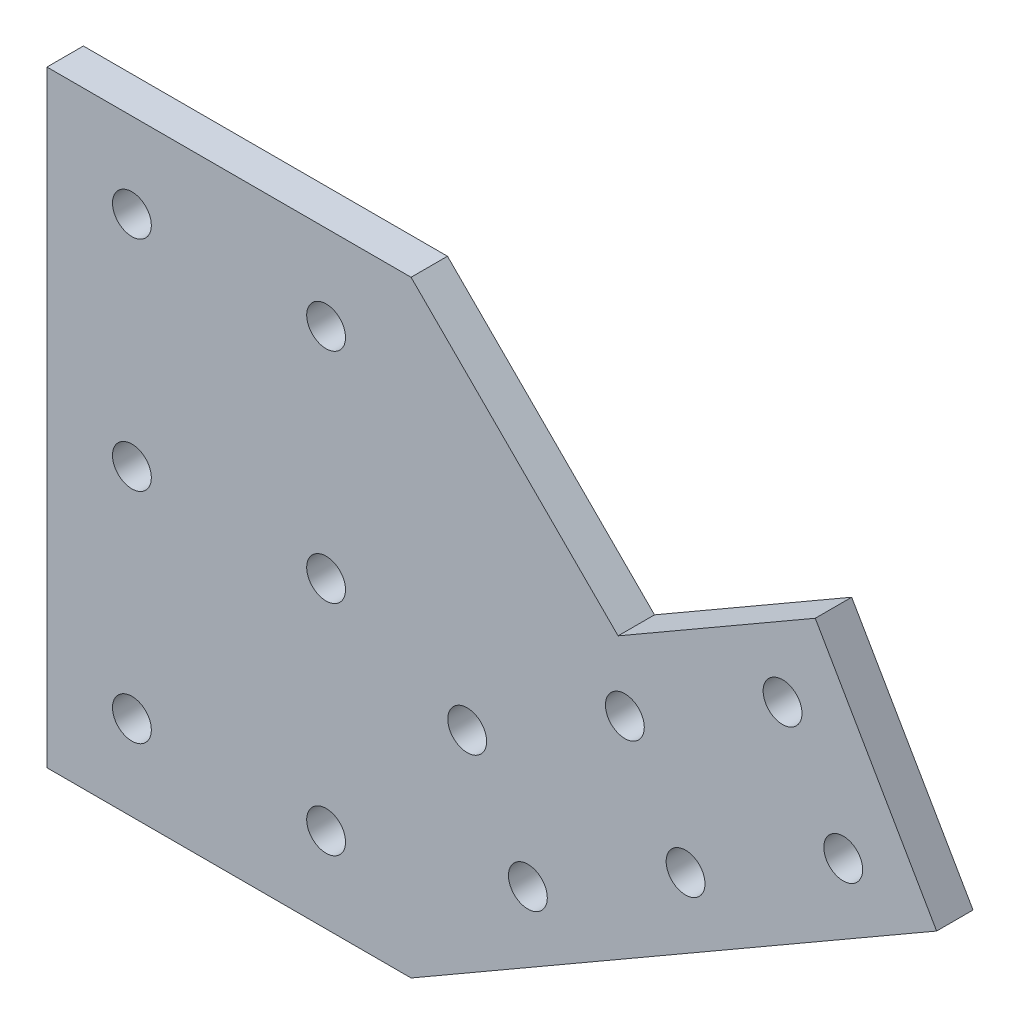
ISO-10303-21;
HEADER;
FILE_DESCRIPTION(('STEP AP214'),'2;1');
FILE_NAME('part.step','',(''),(''),'','','');
FILE_SCHEMA(('AUTOMOTIVE_DESIGN { 1 0 10303 214 1 1 1 1 }'));
ENDSEC;
DATA;
#1=APPLICATION_CONTEXT('core data for automotive mechanical design processes');
#2=APPLICATION_PROTOCOL_DEFINITION('international standard','automotive_design',2000,#1);
#3=PRODUCT_CONTEXT('',#1,'mechanical');
#4=PRODUCT('Part','Part','',(#3));
#5=PRODUCT_RELATED_PRODUCT_CATEGORY('part','',(#4));
#6=PRODUCT_DEFINITION_FORMATION('','',#4);
#7=PRODUCT_DEFINITION_CONTEXT('part definition',#1,'design');
#8=PRODUCT_DEFINITION('design','',#6,#7);
#9=PRODUCT_DEFINITION_SHAPE('','',#8);
#10=(LENGTH_UNIT() NAMED_UNIT(*) SI_UNIT(.MILLI.,.METRE.));
#11=(NAMED_UNIT(*) PLANE_ANGLE_UNIT() SI_UNIT($,.RADIAN.));
#12=(NAMED_UNIT(*) SI_UNIT($,.STERADIAN.) SOLID_ANGLE_UNIT());
#13=UNCERTAINTY_MEASURE_WITH_UNIT(LENGTH_MEASURE(1.E-05),#10,'distance_accuracy_value','');
#14=(GEOMETRIC_REPRESENTATION_CONTEXT(3) GLOBAL_UNCERTAINTY_ASSIGNED_CONTEXT((#13)) GLOBAL_UNIT_ASSIGNED_CONTEXT((#10,
#11,#12)) REPRESENTATION_CONTEXT('',''));
#15=CARTESIAN_POINT('',(0.,0.,0.));
#16=DIRECTION('',(0.,0.,1.));
#17=DIRECTION('',(1.,0.,0.));
#18=AXIS2_PLACEMENT_3D('',#15,#16,#17);
#19=CARTESIAN_POINT('',(43.301270189222,24.9999999999999,3.));
#20=DIRECTION('',(-0.499999999999998,0.86602540378444,0.));
#21=DIRECTION('',(-0.86602540378444,-0.499999999999998,0.));
#22=AXIS2_PLACEMENT_3D('',#19,#20,#21);
#23=PLANE('',#22);
#24=DIRECTION('',(0.86602540378444,0.499999999999998,0.));
#25=VECTOR('',#24,1.);
#26=CARTESIAN_POINT('',(43.301270189222,24.9999999999999,0.));
#27=LINE('',#26,#25);
#28=CARTESIAN_POINT('',(0.,0.,0.));
#29=VERTEX_POINT('',#28);
#30=CARTESIAN_POINT('',(43.301270189222,24.9999999999999,0.));
#31=VERTEX_POINT('',#30);
#32=EDGE_CURVE('E129',#29,#31,#27,.T.);
#33=ORIENTED_EDGE('',*,*,#32,.T.);
#34=DIRECTION('',(0.,0.,-1.));
#35=VECTOR('',#34,1.);
#36=CARTESIAN_POINT('',(43.301270189222,24.9999999999999,3.));
#37=LINE('',#36,#35);
#38=CARTESIAN_POINT('',(43.301270189222,24.9999999999999,3.));
#39=VERTEX_POINT('',#38);
#40=EDGE_CURVE('E11',#39,#31,#37,.T.);
#41=ORIENTED_EDGE('',*,*,#40,.F.);
#42=DIRECTION('',(0.86602540378444,0.499999999999998,0.));
#43=VECTOR('',#42,1.);
#44=CARTESIAN_POINT('',(43.301270189222,24.9999999999999,3.));
#45=LINE('',#44,#43);
#46=CARTESIAN_POINT('',(0.,0.,3.));
#47=VERTEX_POINT('',#46);
#48=EDGE_CURVE('E142',#47,#39,#45,.T.);
#49=ORIENTED_EDGE('',*,*,#48,.F.);
#50=DIRECTION('',(0.,0.,-1.));
#51=VECTOR('',#50,1.);
#52=CARTESIAN_POINT('',(0.,0.,3.));
#53=LINE('',#52,#51);
#54=EDGE_CURVE('E125',#47,#29,#53,.T.);
#55=ORIENTED_EDGE('',*,*,#54,.T.);
#56=EDGE_LOOP('',(#33,#41,#49,#55));
#57=FACE_BOUND('',#56,.T.);
#58=ADVANCED_FACE('F39',(#57),#23,.F.);
#59=CARTESIAN_POINT('',(33.301270189222,42.3205080756887,3.));
#60=DIRECTION('',(-0.86602540378444,-0.499999999999998,0.));
#61=DIRECTION('',(0.499999999999998,-0.86602540378444,0.));
#62=AXIS2_PLACEMENT_3D('',#59,#60,#61);
#63=PLANE('',#62);
#64=DIRECTION('',(-0.499999999999998,0.86602540378444,0.));
#65=VECTOR('',#64,1.);
#66=CARTESIAN_POINT('',(33.301270189222,42.3205080756887,0.));
#67=LINE('',#66,#65);
#68=CARTESIAN_POINT('',(33.301270189222,42.3205080756887,0.));
#69=VERTEX_POINT('',#68);
#70=EDGE_CURVE('E132',#31,#69,#67,.T.);
#71=ORIENTED_EDGE('',*,*,#70,.T.);
#72=DIRECTION('',(0.,0.,-1.));
#73=VECTOR('',#72,1.);
#74=CARTESIAN_POINT('',(33.301270189222,42.3205080756887,3.));
#75=LINE('',#74,#73);
#76=CARTESIAN_POINT('',(33.301270189222,42.3205080756887,3.));
#77=VERTEX_POINT('',#76);
#78=EDGE_CURVE('E47',#77,#69,#75,.T.);
#79=ORIENTED_EDGE('',*,*,#78,.F.);
#80=DIRECTION('',(-0.499999999999998,0.86602540378444,0.));
#81=VECTOR('',#80,1.);
#82=CARTESIAN_POINT('',(33.301270189222,42.3205080756887,3.));
#83=LINE('',#82,#81);
#84=EDGE_CURVE('E95',#39,#77,#83,.T.);
#85=ORIENTED_EDGE('',*,*,#84,.F.);
#86=ORIENTED_EDGE('',*,*,#40,.T.);
#87=EDGE_LOOP('',(#71,#79,#85,#86));
#88=FACE_BOUND('',#87,.T.);
#89=ADVANCED_FACE('F274',(#88),#63,.F.);
#90=CARTESIAN_POINT('',(17.0577136594005,32.9422863405994,3.));
#91=DIRECTION('',(0.499999999999998,-0.86602540378444,0.));
#92=DIRECTION('',(0.86602540378444,0.499999999999998,0.));
#93=AXIS2_PLACEMENT_3D('',#90,#91,#92);
#94=PLANE('',#93);
#95=DIRECTION('',(-0.86602540378444,-0.499999999999998,0.));
#96=VECTOR('',#95,1.);
#97=CARTESIAN_POINT('',(17.0577136594005,32.9422863405994,0.));
#98=LINE('',#97,#96);
#99=CARTESIAN_POINT('',(17.0577136594005,32.9422863405994,0.));
#100=VERTEX_POINT('',#99);
#101=EDGE_CURVE('E135',#69,#100,#98,.T.);
#102=ORIENTED_EDGE('',*,*,#101,.T.);
#103=DIRECTION('',(0.,0.,-1.));
#104=VECTOR('',#103,1.);
#105=CARTESIAN_POINT('',(17.0577136594005,32.9422863405994,3.));
#106=LINE('',#105,#104);
#107=CARTESIAN_POINT('',(17.0577136594005,32.9422863405994,3.));
#108=VERTEX_POINT('',#107);
#109=EDGE_CURVE('E146',#108,#100,#106,.T.);
#110=ORIENTED_EDGE('',*,*,#109,.F.);
#111=DIRECTION('',(-0.86602540378444,-0.499999999999998,0.));
#112=VECTOR('',#111,1.);
#113=CARTESIAN_POINT('',(17.0577136594005,32.9422863405994,3.));
#114=LINE('',#113,#112);
#115=EDGE_CURVE('E154',#77,#108,#114,.T.);
#116=ORIENTED_EDGE('',*,*,#115,.F.);
#117=ORIENTED_EDGE('',*,*,#78,.T.);
#118=EDGE_LOOP('',(#102,#110,#116,#117));
#119=FACE_BOUND('',#118,.T.);
#120=ADVANCED_FACE('F152',(#119),#94,.F.);
#121=CARTESIAN_POINT('',(0.,50.,3.));
#122=DIRECTION('',(-0.707106781186551,-0.707106781186544,0.));
#123=DIRECTION('',(0.707106781186544,-0.707106781186551,0.));
#124=AXIS2_PLACEMENT_3D('',#121,#122,#123);
#125=PLANE('',#124);
#126=DIRECTION('',(-0.707106781186544,0.707106781186551,0.));
#127=VECTOR('',#126,1.);
#128=CARTESIAN_POINT('',(0.,50.,0.));
#129=LINE('',#128,#127);
#130=CARTESIAN_POINT('',(0.,50.,0.));
#131=VERTEX_POINT('',#130);
#132=EDGE_CURVE('E137',#100,#131,#129,.T.);
#133=ORIENTED_EDGE('',*,*,#132,.T.);
#134=DIRECTION('',(0.,0.,-1.));
#135=VECTOR('',#134,1.);
#136=CARTESIAN_POINT('',(0.,50.,3.));
#137=LINE('',#136,#135);
#138=CARTESIAN_POINT('',(0.,50.,3.));
#139=VERTEX_POINT('',#138);
#140=EDGE_CURVE('E120',#139,#131,#137,.T.);
#141=ORIENTED_EDGE('',*,*,#140,.F.);
#142=DIRECTION('',(-0.707106781186544,0.707106781186551,0.));
#143=VECTOR('',#142,1.);
#144=CARTESIAN_POINT('',(0.,50.,3.));
#145=LINE('',#144,#143);
#146=EDGE_CURVE('E111',#108,#139,#145,.T.);
#147=ORIENTED_EDGE('',*,*,#146,.F.);
#148=ORIENTED_EDGE('',*,*,#109,.T.);
#149=EDGE_LOOP('',(#133,#141,#147,#148));
#150=FACE_BOUND('',#149,.T.);
#151=ADVANCED_FACE('F160',(#150),#125,.F.);
#152=CARTESIAN_POINT('',(-30.,50.,3.));
#153=DIRECTION('',(0.,-1.,0.));
#154=DIRECTION('',(0.,0.,-1.));
#155=AXIS2_PLACEMENT_3D('',#152,#153,#154);
#156=PLANE('',#155);
#157=DIRECTION('',(-1.,0.,0.));
#158=VECTOR('',#157,1.);
#159=CARTESIAN_POINT('',(-30.,50.,0.));
#160=LINE('',#159,#158);
#161=CARTESIAN_POINT('',(-30.,50.,0.));
#162=VERTEX_POINT('',#161);
#163=EDGE_CURVE('E119',#131,#162,#160,.T.);
#164=ORIENTED_EDGE('',*,*,#163,.T.);
#165=DIRECTION('',(0.,0.,-1.));
#166=VECTOR('',#165,1.);
#167=CARTESIAN_POINT('',(-30.,50.,3.));
#168=LINE('',#167,#166);
#169=CARTESIAN_POINT('',(-30.,50.,3.));
#170=VERTEX_POINT('',#169);
#171=EDGE_CURVE('E116',#170,#162,#168,.T.);
#172=ORIENTED_EDGE('',*,*,#171,.F.);
#173=DIRECTION('',(-1.,0.,0.));
#174=VECTOR('',#173,1.);
#175=CARTESIAN_POINT('',(-30.,50.,3.));
#176=LINE('',#175,#174);
#177=EDGE_CURVE('E105',#139,#170,#176,.T.);
#178=ORIENTED_EDGE('',*,*,#177,.F.);
#179=ORIENTED_EDGE('',*,*,#140,.T.);
#180=EDGE_LOOP('',(#164,#172,#178,#179));
#181=FACE_BOUND('',#180,.T.);
#182=ADVANCED_FACE('F117',(#181),#156,.F.);
#183=CARTESIAN_POINT('',(-30.,0.,3.));
#184=DIRECTION('',(1.,0.,0.));
#185=DIRECTION('',(0.,0.,-1.));
#186=AXIS2_PLACEMENT_3D('',#183,#184,#185);
#187=PLANE('',#186);
#188=DIRECTION('',(0.,-1.,0.));
#189=VECTOR('',#188,1.);
#190=CARTESIAN_POINT('',(-30.,0.,0.));
#191=LINE('',#190,#189);
#192=CARTESIAN_POINT('',(-30.,0.,0.));
#193=VERTEX_POINT('',#192);
#194=EDGE_CURVE('E81',#162,#193,#191,.T.);
#195=ORIENTED_EDGE('',*,*,#194,.T.);
#196=DIRECTION('',(0.,0.,-1.));
#197=VECTOR('',#196,1.);
#198=CARTESIAN_POINT('',(-30.,0.,3.));
#199=LINE('',#198,#197);
#200=CARTESIAN_POINT('',(-30.,0.,3.));
#201=VERTEX_POINT('',#200);
#202=EDGE_CURVE('E121',#201,#193,#199,.T.);
#203=ORIENTED_EDGE('',*,*,#202,.F.);
#204=DIRECTION('',(0.,-1.,0.));
#205=VECTOR('',#204,1.);
#206=CARTESIAN_POINT('',(-30.,0.,3.));
#207=LINE('',#206,#205);
#208=EDGE_CURVE('E109',#170,#201,#207,.T.);
#209=ORIENTED_EDGE('',*,*,#208,.F.);
#210=ORIENTED_EDGE('',*,*,#171,.T.);
#211=EDGE_LOOP('',(#195,#203,#209,#210));
#212=FACE_BOUND('',#211,.T.);
#213=ADVANCED_FACE('F123',(#212),#187,.F.);
#214=CARTESIAN_POINT('',(0.,0.,3.));
#215=DIRECTION('',(0.,1.,0.));
#216=DIRECTION('',(-1.,0.,0.));
#217=AXIS2_PLACEMENT_3D('',#214,#215,#216);
#218=PLANE('',#217);
#219=DIRECTION('',(1.,0.,0.));
#220=VECTOR('',#219,1.);
#221=CARTESIAN_POINT('',(0.,0.,0.));
#222=LINE('',#221,#220);
#223=EDGE_CURVE('E87',#193,#29,#222,.T.);
#224=ORIENTED_EDGE('',*,*,#223,.T.);
#225=ORIENTED_EDGE('',*,*,#54,.F.);
#226=DIRECTION('',(1.,0.,0.));
#227=VECTOR('',#226,1.);
#228=CARTESIAN_POINT('',(0.,0.,3.));
#229=LINE('',#228,#227);
#230=EDGE_CURVE('E55',#201,#47,#229,.T.);
#231=ORIENTED_EDGE('',*,*,#230,.F.);
#232=ORIENTED_EDGE('',*,*,#202,.T.);
#233=EDGE_LOOP('',(#224,#225,#231,#232));
#234=FACE_BOUND('',#233,.T.);
#235=ADVANCED_FACE('F249',(#234),#218,.F.);
#236=CARTESIAN_POINT('',(0.,0.,3.));
#237=DIRECTION('',(0.,0.,1.));
#238=DIRECTION('',(1.,0.,0.));
#239=AXIS2_PLACEMENT_3D('',#236,#237,#238);
#240=PLANE('',#239);
#241=CARTESIAN_POINT('',(-7.,25.,3.));
#242=DIRECTION('',(0.,0.,1.));
#243=DIRECTION('',(1.,0.,0.));
#244=AXIS2_PLACEMENT_3D('',#241,#242,#243);
#245=CIRCLE('',#244,1.6);
#246=CARTESIAN_POINT('',(-5.4,25.,3.));
#247=VERTEX_POINT('',#246);
#248=EDGE_CURVE('E202',#247,#247,#245,.T.);
#249=ORIENTED_EDGE('',*,*,#248,.F.);
#250=EDGE_LOOP('',(#249));
#251=FACE_BOUND('',#250,.T.);
#252=CARTESIAN_POINT('',(30.6051177665153,34.9903810567666,3.));
#253=DIRECTION('',(0.,0.,1.));
#254=DIRECTION('',(1.,0.,0.));
#255=AXIS2_PLACEMENT_3D('',#252,#253,#254);
#256=CIRCLE('',#255,1.6);
#257=CARTESIAN_POINT('',(32.2051177665153,34.9903810567666,3.));
#258=VERTEX_POINT('',#257);
#259=EDGE_CURVE('E195',#258,#258,#256,.T.);
#260=ORIENTED_EDGE('',*,*,#259,.F.);
#261=EDGE_LOOP('',(#260));
#262=FACE_BOUND('',#261,.T.);
#263=CARTESIAN_POINT('',(35.6051177665153,26.3301270189222,3.));
#264=DIRECTION('',(0.,0.,1.));
#265=DIRECTION('',(1.,0.,0.));
#266=AXIS2_PLACEMENT_3D('',#263,#264,#265);
#267=CIRCLE('',#266,1.6);
#268=CARTESIAN_POINT('',(37.2051177665153,26.3301270189222,3.));
#269=VERTEX_POINT('',#268);
#270=EDGE_CURVE('E214',#269,#269,#267,.T.);
#271=ORIENTED_EDGE('',*,*,#270,.F.);
#272=EDGE_LOOP('',(#271));
#273=FACE_BOUND('',#272,.T.);
#274=CARTESIAN_POINT('',(22.6147367097487,18.8301270189222,3.));
#275=DIRECTION('',(0.,0.,1.));
#276=DIRECTION('',(1.,0.,0.));
#277=AXIS2_PLACEMENT_3D('',#274,#275,#276);
#278=CIRCLE('',#277,1.6);
#279=CARTESIAN_POINT('',(24.2147367097487,18.8301270189222,3.));
#280=VERTEX_POINT('',#279);
#281=EDGE_CURVE('E207',#280,#280,#278,.T.);
#282=ORIENTED_EDGE('',*,*,#281,.F.);
#283=EDGE_LOOP('',(#282));
#284=FACE_BOUND('',#283,.T.);
#285=CARTESIAN_POINT('',(-7.,43.,3.));
#286=DIRECTION('',(0.,0.,1.));
#287=DIRECTION('',(1.,0.,0.));
#288=AXIS2_PLACEMENT_3D('',#285,#286,#287);
#289=CIRCLE('',#288,1.6);
#290=CARTESIAN_POINT('',(-5.4,43.,3.));
#291=VERTEX_POINT('',#290);
#292=EDGE_CURVE('E178',#291,#291,#289,.T.);
#293=ORIENTED_EDGE('',*,*,#292,.F.);
#294=EDGE_LOOP('',(#293));
#295=FACE_BOUND('',#294,.T.);
#296=CARTESIAN_POINT('',(-23.,7.,3.));
#297=DIRECTION('',(0.,0.,1.));
#298=DIRECTION('',(1.,0.,0.));
#299=AXIS2_PLACEMENT_3D('',#296,#297,#298);
#300=CIRCLE('',#299,1.6);
#301=CARTESIAN_POINT('',(-21.4,7.,3.));
#302=VERTEX_POINT('',#301);
#303=EDGE_CURVE('E171',#302,#302,#300,.T.);
#304=ORIENTED_EDGE('',*,*,#303,.F.);
#305=EDGE_LOOP('',(#304));
#306=FACE_BOUND('',#305,.T.);
#307=CARTESIAN_POINT('',(-7.,7.,3.));
#308=DIRECTION('',(0.,0.,1.));
#309=DIRECTION('',(1.,0.,0.));
#310=AXIS2_PLACEMENT_3D('',#307,#308,#309);
#311=CIRCLE('',#310,1.6);
#312=CARTESIAN_POINT('',(-5.4,7.,3.));
#313=VERTEX_POINT('',#312);
#314=EDGE_CURVE('E190',#313,#313,#311,.T.);
#315=ORIENTED_EDGE('',*,*,#314,.F.);
#316=EDGE_LOOP('',(#315));
#317=FACE_BOUND('',#316,.T.);
#318=CARTESIAN_POINT('',(-23.,25.,3.));
#319=DIRECTION('',(0.,0.,1.));
#320=DIRECTION('',(1.,0.,0.));
#321=AXIS2_PLACEMENT_3D('',#318,#319,#320);
#322=CIRCLE('',#321,1.6);
#323=CARTESIAN_POINT('',(-21.4,25.,3.));
#324=VERTEX_POINT('',#323);
#325=EDGE_CURVE('E183',#324,#324,#322,.T.);
#326=ORIENTED_EDGE('',*,*,#325,.F.);
#327=EDGE_LOOP('',(#326));
#328=FACE_BOUND('',#327,.T.);
#329=CARTESIAN_POINT('',(17.6147367097487,27.4903810567666,3.));
#330=DIRECTION('',(0.,0.,1.));
#331=DIRECTION('',(1.,0.,0.));
#332=AXIS2_PLACEMENT_3D('',#329,#330,#331);
#333=CIRCLE('',#332,1.6);
#334=CARTESIAN_POINT('',(19.2147367097487,27.4903810567666,3.));
#335=VERTEX_POINT('',#334);
#336=EDGE_CURVE('E231',#335,#335,#333,.T.);
#337=ORIENTED_EDGE('',*,*,#336,.F.);
#338=EDGE_LOOP('',(#337));
#339=FACE_BOUND('',#338,.T.);
#340=CARTESIAN_POINT('',(4.62435565298215,19.9903810567666,3.));
#341=DIRECTION('',(0.,0.,1.));
#342=DIRECTION('',(1.,0.,0.));
#343=AXIS2_PLACEMENT_3D('',#340,#341,#342);
#344=CIRCLE('',#343,1.6);
#345=CARTESIAN_POINT('',(6.22435565298214,19.9903810567666,3.));
#346=VERTEX_POINT('',#345);
#347=EDGE_CURVE('E225',#346,#346,#344,.T.);
#348=ORIENTED_EDGE('',*,*,#347,.F.);
#349=EDGE_LOOP('',(#348));
#350=FACE_BOUND('',#349,.T.);
#351=CARTESIAN_POINT('',(9.62435565298215,11.3301270189222,3.));
#352=DIRECTION('',(0.,0.,1.));
#353=DIRECTION('',(1.,0.,0.));
#354=AXIS2_PLACEMENT_3D('',#351,#352,#353);
#355=CIRCLE('',#354,1.6);
#356=CARTESIAN_POINT('',(11.2243556529822,11.3301270189222,3.));
#357=VERTEX_POINT('',#356);
#358=EDGE_CURVE('E219',#357,#357,#355,.T.);
#359=ORIENTED_EDGE('',*,*,#358,.F.);
#360=EDGE_LOOP('',(#359));
#361=FACE_BOUND('',#360,.T.);
#362=CARTESIAN_POINT('',(-23.,43.,3.));
#363=DIRECTION('',(0.,0.,1.));
#364=DIRECTION('',(1.,0.,0.));
#365=AXIS2_PLACEMENT_3D('',#362,#363,#364);
#366=CIRCLE('',#365,1.6);
#367=CARTESIAN_POINT('',(-21.4,43.,3.));
#368=VERTEX_POINT('',#367);
#369=EDGE_CURVE('E165',#368,#368,#366,.T.);
#370=ORIENTED_EDGE('',*,*,#369,.F.);
#371=EDGE_LOOP('',(#370));
#372=FACE_BOUND('',#371,.T.);
#373=ORIENTED_EDGE('',*,*,#48,.T.);
#374=ORIENTED_EDGE('',*,*,#84,.T.);
#375=ORIENTED_EDGE('',*,*,#115,.T.);
#376=ORIENTED_EDGE('',*,*,#146,.T.);
#377=ORIENTED_EDGE('',*,*,#177,.T.);
#378=ORIENTED_EDGE('',*,*,#208,.T.);
#379=ORIENTED_EDGE('',*,*,#230,.T.);
#380=EDGE_LOOP('',(#373,#374,#375,#376,#377,#378,#379));
#381=FACE_BOUND('',#380,.T.);
#382=ADVANCED_FACE('F107',(#251,#262,#273,#284,#295,#306,#317,#328,#339,#350,#361,#372,#381),
#240,.T.);
#383=CARTESIAN_POINT('',(0.,0.,0.));
#384=DIRECTION('',(0.,0.,1.));
#385=DIRECTION('',(1.,0.,0.));
#386=AXIS2_PLACEMENT_3D('',#383,#384,#385);
#387=PLANE('',#386);
#388=CARTESIAN_POINT('',(-7.,25.,0.));
#389=DIRECTION('',(0.,0.,1.));
#390=DIRECTION('',(1.,0.,0.));
#391=AXIS2_PLACEMENT_3D('',#388,#389,#390);
#392=CIRCLE('',#391,1.6);
#393=CARTESIAN_POINT('',(-5.4,25.,0.));
#394=VERTEX_POINT('',#393);
#395=EDGE_CURVE('E187',#394,#394,#392,.T.);
#396=ORIENTED_EDGE('',*,*,#395,.T.);
#397=EDGE_LOOP('',(#396));
#398=FACE_BOUND('',#397,.T.);
#399=CARTESIAN_POINT('',(30.6051177665153,34.9903810567666,0.));
#400=DIRECTION('',(0.,0.,1.));
#401=DIRECTION('',(1.,0.,0.));
#402=AXIS2_PLACEMENT_3D('',#399,#400,#401);
#403=CIRCLE('',#402,1.6);
#404=CARTESIAN_POINT('',(32.2051177665153,34.9903810567666,0.));
#405=VERTEX_POINT('',#404);
#406=EDGE_CURVE('E198',#405,#405,#403,.T.);
#407=ORIENTED_EDGE('',*,*,#406,.T.);
#408=EDGE_LOOP('',(#407));
#409=FACE_BOUND('',#408,.T.);
#410=CARTESIAN_POINT('',(35.6051177665153,26.3301270189222,0.));
#411=DIRECTION('',(0.,0.,1.));
#412=DIRECTION('',(1.,0.,0.));
#413=AXIS2_PLACEMENT_3D('',#410,#411,#412);
#414=CIRCLE('',#413,1.6);
#415=CARTESIAN_POINT('',(37.2051177665153,26.3301270189222,0.));
#416=VERTEX_POINT('',#415);
#417=EDGE_CURVE('E199',#416,#416,#414,.T.);
#418=ORIENTED_EDGE('',*,*,#417,.T.);
#419=EDGE_LOOP('',(#418));
#420=FACE_BOUND('',#419,.T.);
#421=CARTESIAN_POINT('',(22.6147367097487,18.8301270189222,0.));
#422=DIRECTION('',(0.,0.,1.));
#423=DIRECTION('',(1.,0.,0.));
#424=AXIS2_PLACEMENT_3D('',#421,#422,#423);
#425=CIRCLE('',#424,1.6);
#426=CARTESIAN_POINT('',(24.2147367097487,18.8301270189222,0.));
#427=VERTEX_POINT('',#426);
#428=EDGE_CURVE('E210',#427,#427,#425,.T.);
#429=ORIENTED_EDGE('',*,*,#428,.T.);
#430=EDGE_LOOP('',(#429));
#431=FACE_BOUND('',#430,.T.);
#432=CARTESIAN_POINT('',(-7.,43.,0.));
#433=DIRECTION('',(0.,0.,1.));
#434=DIRECTION('',(1.,0.,0.));
#435=AXIS2_PLACEMENT_3D('',#432,#433,#434);
#436=CIRCLE('',#435,1.6);
#437=CARTESIAN_POINT('',(-5.4,43.,0.));
#438=VERTEX_POINT('',#437);
#439=EDGE_CURVE('E168',#438,#438,#436,.T.);
#440=ORIENTED_EDGE('',*,*,#439,.T.);
#441=EDGE_LOOP('',(#440));
#442=FACE_BOUND('',#441,.T.);
#443=CARTESIAN_POINT('',(-23.,7.,0.));
#444=DIRECTION('',(0.,0.,1.));
#445=DIRECTION('',(1.,0.,0.));
#446=AXIS2_PLACEMENT_3D('',#443,#444,#445);
#447=CIRCLE('',#446,1.6);
#448=CARTESIAN_POINT('',(-21.4,7.,0.));
#449=VERTEX_POINT('',#448);
#450=EDGE_CURVE('E174',#449,#449,#447,.T.);
#451=ORIENTED_EDGE('',*,*,#450,.T.);
#452=EDGE_LOOP('',(#451));
#453=FACE_BOUND('',#452,.T.);
#454=CARTESIAN_POINT('',(-7.,7.,0.));
#455=DIRECTION('',(0.,0.,1.));
#456=DIRECTION('',(1.,0.,0.));
#457=AXIS2_PLACEMENT_3D('',#454,#455,#456);
#458=CIRCLE('',#457,1.6);
#459=CARTESIAN_POINT('',(-5.4,7.,0.));
#460=VERTEX_POINT('',#459);
#461=EDGE_CURVE('E175',#460,#460,#458,.T.);
#462=ORIENTED_EDGE('',*,*,#461,.T.);
#463=EDGE_LOOP('',(#462));
#464=FACE_BOUND('',#463,.T.);
#465=CARTESIAN_POINT('',(-23.,25.,0.));
#466=DIRECTION('',(0.,0.,1.));
#467=DIRECTION('',(1.,0.,0.));
#468=AXIS2_PLACEMENT_3D('',#465,#466,#467);
#469=CIRCLE('',#468,1.6);
#470=CARTESIAN_POINT('',(-21.4,25.,0.));
#471=VERTEX_POINT('',#470);
#472=EDGE_CURVE('E186',#471,#471,#469,.T.);
#473=ORIENTED_EDGE('',*,*,#472,.T.);
#474=EDGE_LOOP('',(#473));
#475=FACE_BOUND('',#474,.T.);
#476=CARTESIAN_POINT('',(17.6147367097487,27.4903810567666,0.));
#477=DIRECTION('',(0.,0.,1.));
#478=DIRECTION('',(1.,0.,0.));
#479=AXIS2_PLACEMENT_3D('',#476,#477,#478);
#480=CIRCLE('',#479,1.6);
#481=CARTESIAN_POINT('',(19.2147367097487,27.4903810567666,0.));
#482=VERTEX_POINT('',#481);
#483=EDGE_CURVE('E211',#482,#482,#480,.T.);
#484=ORIENTED_EDGE('',*,*,#483,.T.);
#485=EDGE_LOOP('',(#484));
#486=FACE_BOUND('',#485,.T.);
#487=CARTESIAN_POINT('',(4.62435565298215,19.9903810567666,0.));
#488=DIRECTION('',(0.,0.,1.));
#489=DIRECTION('',(1.,0.,0.));
#490=AXIS2_PLACEMENT_3D('',#487,#488,#489);
#491=CIRCLE('',#490,1.6);
#492=CARTESIAN_POINT('',(6.22435565298214,19.9903810567666,0.));
#493=VERTEX_POINT('',#492);
#494=EDGE_CURVE('E228',#493,#493,#491,.T.);
#495=ORIENTED_EDGE('',*,*,#494,.T.);
#496=EDGE_LOOP('',(#495));
#497=FACE_BOUND('',#496,.T.);
#498=CARTESIAN_POINT('',(9.62435565298215,11.3301270189222,0.));
#499=DIRECTION('',(0.,0.,1.));
#500=DIRECTION('',(1.,0.,0.));
#501=AXIS2_PLACEMENT_3D('',#498,#499,#500);
#502=CIRCLE('',#501,1.6);
#503=CARTESIAN_POINT('',(11.2243556529822,11.3301270189222,0.));
#504=VERTEX_POINT('',#503);
#505=EDGE_CURVE('E222',#504,#504,#502,.T.);
#506=ORIENTED_EDGE('',*,*,#505,.T.);
#507=EDGE_LOOP('',(#506));
#508=FACE_BOUND('',#507,.T.);
#509=CARTESIAN_POINT('',(-23.,43.,0.));
#510=DIRECTION('',(0.,0.,1.));
#511=DIRECTION('',(1.,0.,0.));
#512=AXIS2_PLACEMENT_3D('',#509,#510,#511);
#513=CIRCLE('',#512,1.6);
#514=CARTESIAN_POINT('',(-21.4,43.,0.));
#515=VERTEX_POINT('',#514);
#516=EDGE_CURVE('E133',#515,#515,#513,.T.);
#517=ORIENTED_EDGE('',*,*,#516,.T.);
#518=EDGE_LOOP('',(#517));
#519=FACE_BOUND('',#518,.T.);
#520=ORIENTED_EDGE('',*,*,#32,.F.);
#521=ORIENTED_EDGE('',*,*,#223,.F.);
#522=ORIENTED_EDGE('',*,*,#194,.F.);
#523=ORIENTED_EDGE('',*,*,#163,.F.);
#524=ORIENTED_EDGE('',*,*,#132,.F.);
#525=ORIENTED_EDGE('',*,*,#101,.F.);
#526=ORIENTED_EDGE('',*,*,#70,.F.);
#527=EDGE_LOOP('',(#520,#521,#522,#523,#524,#525,#526));
#528=FACE_BOUND('',#527,.T.);
#529=ADVANCED_FACE('F158',(#398,#409,#420,#431,#442,#453,#464,#475,#486,#497,#508,#519,#528),
#387,.F.);
#530=CARTESIAN_POINT('',(-23.,43.,0.));
#531=DIRECTION('',(0.,0.,1.));
#532=DIRECTION('',(1.,0.,0.));
#533=AXIS2_PLACEMENT_3D('',#530,#531,#532);
#534=CYLINDRICAL_SURFACE('',#533,1.6);
#535=ORIENTED_EDGE('',*,*,#516,.F.);
#536=EDGE_LOOP('',(#535));
#537=FACE_BOUND('',#536,.T.);
#538=ORIENTED_EDGE('',*,*,#369,.T.);
#539=EDGE_LOOP('',(#538));
#540=FACE_BOUND('',#539,.T.);
#541=ADVANCED_FACE('F258',(#537,#540),#534,.F.);
#542=CARTESIAN_POINT('',(9.62435565298215,11.3301270189222,0.));
#543=DIRECTION('',(0.,0.,1.));
#544=DIRECTION('',(1.,0.,0.));
#545=AXIS2_PLACEMENT_3D('',#542,#543,#544);
#546=CYLINDRICAL_SURFACE('',#545,1.6);
#547=ORIENTED_EDGE('',*,*,#505,.F.);
#548=EDGE_LOOP('',(#547));
#549=FACE_BOUND('',#548,.T.);
#550=ORIENTED_EDGE('',*,*,#358,.T.);
#551=EDGE_LOOP('',(#550));
#552=FACE_BOUND('',#551,.T.);
#553=ADVANCED_FACE('F260',(#549,#552),#546,.F.);
#554=CARTESIAN_POINT('',(4.62435565298215,19.9903810567666,0.));
#555=DIRECTION('',(0.,0.,1.));
#556=DIRECTION('',(1.,0.,0.));
#557=AXIS2_PLACEMENT_3D('',#554,#555,#556);
#558=CYLINDRICAL_SURFACE('',#557,1.6);
#559=ORIENTED_EDGE('',*,*,#494,.F.);
#560=EDGE_LOOP('',(#559));
#561=FACE_BOUND('',#560,.T.);
#562=ORIENTED_EDGE('',*,*,#347,.T.);
#563=EDGE_LOOP('',(#562));
#564=FACE_BOUND('',#563,.T.);
#565=ADVANCED_FACE('F243',(#561,#564),#558,.F.);
#566=CARTESIAN_POINT('',(17.6147367097487,27.4903810567666,0.));
#567=DIRECTION('',(0.,0.,1.));
#568=DIRECTION('',(1.,0.,0.));
#569=AXIS2_PLACEMENT_3D('',#566,#567,#568);
#570=CYLINDRICAL_SURFACE('',#569,1.6);
#571=ORIENTED_EDGE('',*,*,#483,.F.);
#572=EDGE_LOOP('',(#571));
#573=FACE_BOUND('',#572,.T.);
#574=ORIENTED_EDGE('',*,*,#336,.T.);
#575=EDGE_LOOP('',(#574));
#576=FACE_BOUND('',#575,.T.);
#577=ADVANCED_FACE('F239',(#573,#576),#570,.F.);
#578=CARTESIAN_POINT('',(-23.,25.,0.));
#579=DIRECTION('',(0.,0.,1.));
#580=DIRECTION('',(1.,0.,0.));
#581=AXIS2_PLACEMENT_3D('',#578,#579,#580);
#582=CYLINDRICAL_SURFACE('',#581,1.6);
#583=ORIENTED_EDGE('',*,*,#472,.F.);
#584=EDGE_LOOP('',(#583));
#585=FACE_BOUND('',#584,.T.);
#586=ORIENTED_EDGE('',*,*,#325,.T.);
#587=EDGE_LOOP('',(#586));
#588=FACE_BOUND('',#587,.T.);
#589=ADVANCED_FACE('F242',(#585,#588),#582,.F.);
#590=CARTESIAN_POINT('',(-7.,7.,0.));
#591=DIRECTION('',(0.,0.,1.));
#592=DIRECTION('',(1.,0.,0.));
#593=AXIS2_PLACEMENT_3D('',#590,#591,#592);
#594=CYLINDRICAL_SURFACE('',#593,1.6);
#595=ORIENTED_EDGE('',*,*,#461,.F.);
#596=EDGE_LOOP('',(#595));
#597=FACE_BOUND('',#596,.T.);
#598=ORIENTED_EDGE('',*,*,#314,.T.);
#599=EDGE_LOOP('',(#598));
#600=FACE_BOUND('',#599,.T.);
#601=ADVANCED_FACE('F359',(#597,#600),#594,.F.);
#602=CARTESIAN_POINT('',(-23.,7.,0.));
#603=DIRECTION('',(0.,0.,1.));
#604=DIRECTION('',(1.,0.,0.));
#605=AXIS2_PLACEMENT_3D('',#602,#603,#604);
#606=CYLINDRICAL_SURFACE('',#605,1.6);
#607=ORIENTED_EDGE('',*,*,#450,.F.);
#608=EDGE_LOOP('',(#607));
#609=FACE_BOUND('',#608,.T.);
#610=ORIENTED_EDGE('',*,*,#303,.T.);
#611=EDGE_LOOP('',(#610));
#612=FACE_BOUND('',#611,.T.);
#613=ADVANCED_FACE('F369',(#609,#612),#606,.F.);
#614=CARTESIAN_POINT('',(-7.,43.,0.));
#615=DIRECTION('',(0.,0.,1.));
#616=DIRECTION('',(1.,0.,0.));
#617=AXIS2_PLACEMENT_3D('',#614,#615,#616);
#618=CYLINDRICAL_SURFACE('',#617,1.6);
#619=ORIENTED_EDGE('',*,*,#439,.F.);
#620=EDGE_LOOP('',(#619));
#621=FACE_BOUND('',#620,.T.);
#622=ORIENTED_EDGE('',*,*,#292,.T.);
#623=EDGE_LOOP('',(#622));
#624=FACE_BOUND('',#623,.T.);
#625=ADVANCED_FACE('F379',(#621,#624),#618,.F.);
#626=CARTESIAN_POINT('',(22.6147367097487,18.8301270189222,0.));
#627=DIRECTION('',(0.,0.,1.));
#628=DIRECTION('',(1.,0.,0.));
#629=AXIS2_PLACEMENT_3D('',#626,#627,#628);
#630=CYLINDRICAL_SURFACE('',#629,1.6);
#631=ORIENTED_EDGE('',*,*,#428,.F.);
#632=EDGE_LOOP('',(#631));
#633=FACE_BOUND('',#632,.T.);
#634=ORIENTED_EDGE('',*,*,#281,.T.);
#635=EDGE_LOOP('',(#634));
#636=FACE_BOUND('',#635,.T.);
#637=ADVANCED_FACE('F388',(#633,#636),#630,.F.);
#638=CARTESIAN_POINT('',(35.6051177665153,26.3301270189222,0.));
#639=DIRECTION('',(0.,0.,1.));
#640=DIRECTION('',(1.,0.,0.));
#641=AXIS2_PLACEMENT_3D('',#638,#639,#640);
#642=CYLINDRICAL_SURFACE('',#641,1.6);
#643=ORIENTED_EDGE('',*,*,#417,.F.);
#644=EDGE_LOOP('',(#643));
#645=FACE_BOUND('',#644,.T.);
#646=ORIENTED_EDGE('',*,*,#270,.T.);
#647=EDGE_LOOP('',(#646));
#648=FACE_BOUND('',#647,.T.);
#649=ADVANCED_FACE('F398',(#645,#648),#642,.F.);
#650=CARTESIAN_POINT('',(30.6051177665153,34.9903810567666,0.));
#651=DIRECTION('',(0.,0.,1.));
#652=DIRECTION('',(1.,0.,0.));
#653=AXIS2_PLACEMENT_3D('',#650,#651,#652);
#654=CYLINDRICAL_SURFACE('',#653,1.6);
#655=ORIENTED_EDGE('',*,*,#406,.F.);
#656=EDGE_LOOP('',(#655));
#657=FACE_BOUND('',#656,.T.);
#658=ORIENTED_EDGE('',*,*,#259,.T.);
#659=EDGE_LOOP('',(#658));
#660=FACE_BOUND('',#659,.T.);
#661=ADVANCED_FACE('F408',(#657,#660),#654,.F.);
#662=CARTESIAN_POINT('',(-7.,25.,0.));
#663=DIRECTION('',(0.,0.,1.));
#664=DIRECTION('',(1.,0.,0.));
#665=AXIS2_PLACEMENT_3D('',#662,#663,#664);
#666=CYLINDRICAL_SURFACE('',#665,1.6);
#667=ORIENTED_EDGE('',*,*,#395,.F.);
#668=EDGE_LOOP('',(#667));
#669=FACE_BOUND('',#668,.T.);
#670=ORIENTED_EDGE('',*,*,#248,.T.);
#671=EDGE_LOOP('',(#670));
#672=FACE_BOUND('',#671,.T.);
#673=ADVANCED_FACE('F418',(#669,#672),#666,.F.);
#674=CLOSED_SHELL('',(#58,#89,#120,#151,#182,#213,#235,#382,#529,#541,#553,#565,#577,#589,#601,
#613,#625,#637,#649,#661,#673));
#675=MANIFOLD_SOLID_BREP('B2',#674);
#676=ADVANCED_BREP_SHAPE_REPRESENTATION('',(#18,#675),#14);
#677=SHAPE_DEFINITION_REPRESENTATION(#9,#676);
ENDSEC;
END-ISO-10303-21;
